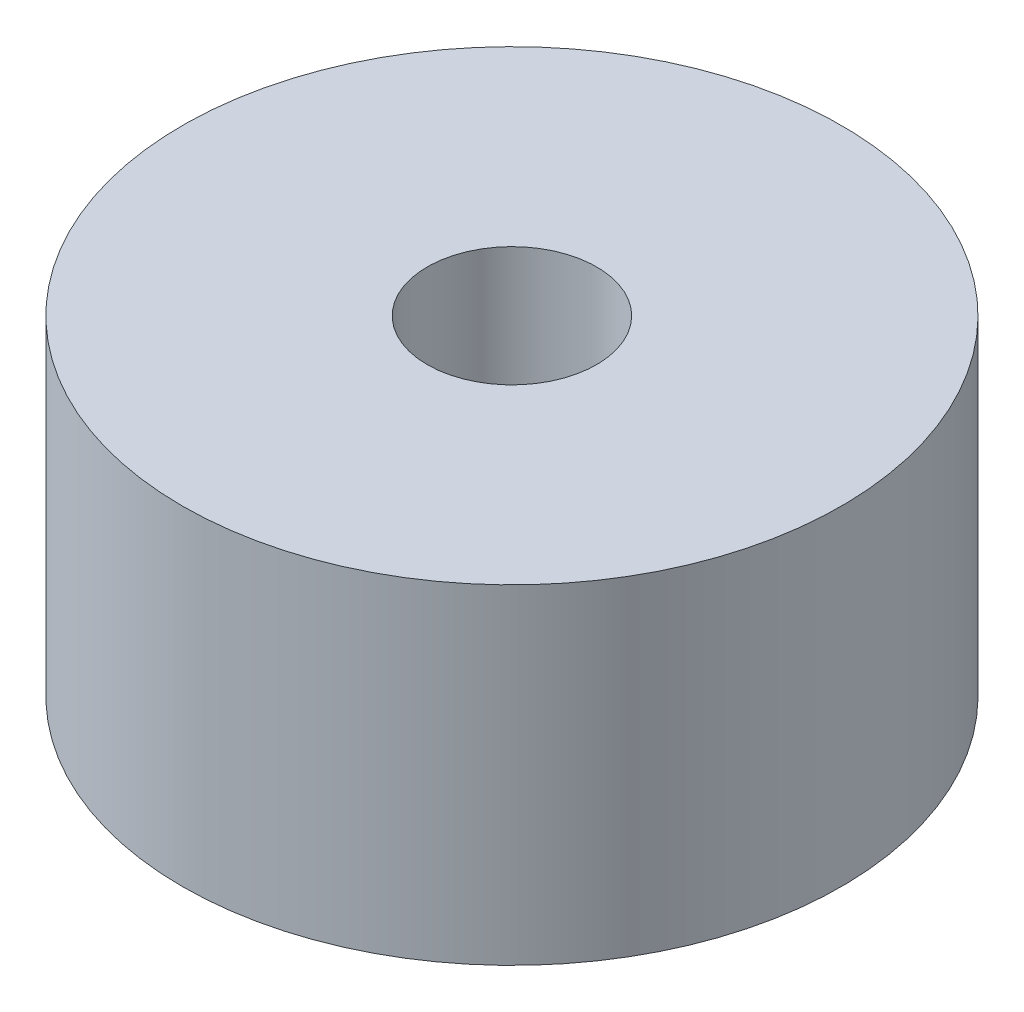
ISO-10303-21;
HEADER;
FILE_DESCRIPTION(('STEP AP214'),'2;1');
FILE_NAME('part.step','',(''),(''),'','','');
FILE_SCHEMA(('AUTOMOTIVE_DESIGN { 1 0 10303 214 1 1 1 1 }'));
ENDSEC;
DATA;
#1=APPLICATION_CONTEXT('core data for automotive mechanical design processes');
#2=APPLICATION_PROTOCOL_DEFINITION('international standard','automotive_design',2000,#1);
#3=PRODUCT_CONTEXT('',#1,'mechanical');
#4=PRODUCT('Part','Part','',(#3));
#5=PRODUCT_RELATED_PRODUCT_CATEGORY('part','',(#4));
#6=PRODUCT_DEFINITION_FORMATION('','',#4);
#7=PRODUCT_DEFINITION_CONTEXT('part definition',#1,'design');
#8=PRODUCT_DEFINITION('design','',#6,#7);
#9=PRODUCT_DEFINITION_SHAPE('','',#8);
#10=(LENGTH_UNIT() NAMED_UNIT(*) SI_UNIT(.MILLI.,.METRE.));
#11=(NAMED_UNIT(*) PLANE_ANGLE_UNIT() SI_UNIT($,.RADIAN.));
#12=(NAMED_UNIT(*) SI_UNIT($,.STERADIAN.) SOLID_ANGLE_UNIT());
#13=UNCERTAINTY_MEASURE_WITH_UNIT(LENGTH_MEASURE(1.E-05),#10,'distance_accuracy_value','');
#14=(GEOMETRIC_REPRESENTATION_CONTEXT(3) GLOBAL_UNCERTAINTY_ASSIGNED_CONTEXT((#13)) GLOBAL_UNIT_ASSIGNED_CONTEXT((#10,
#11,#12)) REPRESENTATION_CONTEXT('',''));
#15=CARTESIAN_POINT('',(0.,0.,0.));
#16=DIRECTION('',(0.,0.,1.));
#17=DIRECTION('',(1.,0.,0.));
#18=AXIS2_PLACEMENT_3D('',#15,#16,#17);
#19=CARTESIAN_POINT('',(0.,12.7,0.));
#20=DIRECTION('',(0.,-1.,0.));
#21=DIRECTION('',(0.,0.,-1.));
#22=AXIS2_PLACEMENT_3D('',#19,#20,#21);
#23=CYLINDRICAL_SURFACE('',#22,12.7);
#24=CARTESIAN_POINT('',(0.,12.7,0.));
#25=DIRECTION('',(0.,1.,0.));
#26=DIRECTION('',(0.,0.,1.));
#27=AXIS2_PLACEMENT_3D('',#24,#25,#26);
#28=CIRCLE('',#27,12.7);
#29=CARTESIAN_POINT('',(0.,12.7,12.7));
#30=VERTEX_POINT('',#29);
#31=EDGE_CURVE('E10',#30,#30,#28,.T.);
#32=ORIENTED_EDGE('',*,*,#31,.F.);
#33=EDGE_LOOP('',(#32));
#34=FACE_BOUND('',#33,.T.);
#35=CARTESIAN_POINT('',(0.,0.,0.));
#36=DIRECTION('',(0.,1.,0.));
#37=DIRECTION('',(0.,0.,1.));
#38=AXIS2_PLACEMENT_3D('',#35,#36,#37);
#39=CIRCLE('',#38,12.7);
#40=CARTESIAN_POINT('',(0.,0.,12.7));
#41=VERTEX_POINT('',#40);
#42=EDGE_CURVE('E34',#41,#41,#39,.T.);
#43=ORIENTED_EDGE('',*,*,#42,.T.);
#44=EDGE_LOOP('',(#43));
#45=FACE_BOUND('',#44,.T.);
#46=ADVANCED_FACE('F31',(#34,#45),#23,.T.);
#47=CARTESIAN_POINT('',(0.,12.7,0.));
#48=DIRECTION('',(0.,1.,0.));
#49=DIRECTION('',(0.,0.,1.));
#50=AXIS2_PLACEMENT_3D('',#47,#48,#49);
#51=PLANE('',#50);
#52=CARTESIAN_POINT('',(0.,12.7,0.));
#53=DIRECTION('',(0.,1.,0.));
#54=DIRECTION('',(0.,0.,1.));
#55=AXIS2_PLACEMENT_3D('',#52,#53,#54);
#56=CIRCLE('',#55,3.26389999999999);
#57=CARTESIAN_POINT('',(0.,12.7,3.26389999999999));
#58=VERTEX_POINT('',#57);
#59=EDGE_CURVE('E45',#58,#58,#56,.T.);
#60=ORIENTED_EDGE('',*,*,#59,.F.);
#61=EDGE_LOOP('',(#60));
#62=FACE_BOUND('',#61,.T.);
#63=ORIENTED_EDGE('',*,*,#31,.T.);
#64=EDGE_LOOP('',(#63));
#65=FACE_BOUND('',#64,.T.);
#66=ADVANCED_FACE('F51',(#62,#65),#51,.T.);
#67=CARTESIAN_POINT('',(0.,0.,0.));
#68=DIRECTION('',(0.,1.,0.));
#69=DIRECTION('',(0.,0.,1.));
#70=AXIS2_PLACEMENT_3D('',#67,#68,#69);
#71=PLANE('',#70);
#72=CARTESIAN_POINT('',(0.,0.,0.));
#73=DIRECTION('',(0.,1.,0.));
#74=DIRECTION('',(0.,0.,1.));
#75=AXIS2_PLACEMENT_3D('',#72,#73,#74);
#76=CIRCLE('',#75,3.2639);
#77=CARTESIAN_POINT('',(0.,0.,3.2639));
#78=VERTEX_POINT('',#77);
#79=EDGE_CURVE('E41',#78,#78,#76,.T.);
#80=ORIENTED_EDGE('',*,*,#79,.T.);
#81=EDGE_LOOP('',(#80));
#82=FACE_BOUND('',#81,.T.);
#83=ORIENTED_EDGE('',*,*,#42,.F.);
#84=EDGE_LOOP('',(#83));
#85=FACE_BOUND('',#84,.T.);
#86=ADVANCED_FACE('F53',(#82,#85),#71,.F.);
#87=CARTESIAN_POINT('',(0.,12.7,0.));
#88=DIRECTION('',(0.,1.,0.));
#89=DIRECTION('',(0.,0.,1.));
#90=AXIS2_PLACEMENT_3D('',#87,#88,#89);
#91=CYLINDRICAL_SURFACE('',#90,3.26389999999999);
#92=ORIENTED_EDGE('',*,*,#79,.F.);
#93=EDGE_LOOP('',(#92));
#94=FACE_BOUND('',#93,.T.);
#95=ORIENTED_EDGE('',*,*,#59,.T.);
#96=EDGE_LOOP('',(#95));
#97=FACE_BOUND('',#96,.T.);
#98=ADVANCED_FACE('F49',(#94,#97),#91,.F.);
#99=CLOSED_SHELL('',(#46,#66,#86,#98));
#100=MANIFOLD_SOLID_BREP('B2',#99);
#101=ADVANCED_BREP_SHAPE_REPRESENTATION('',(#18,#100),#14);
#102=SHAPE_DEFINITION_REPRESENTATION(#9,#101);
ENDSEC;
END-ISO-10303-21;
